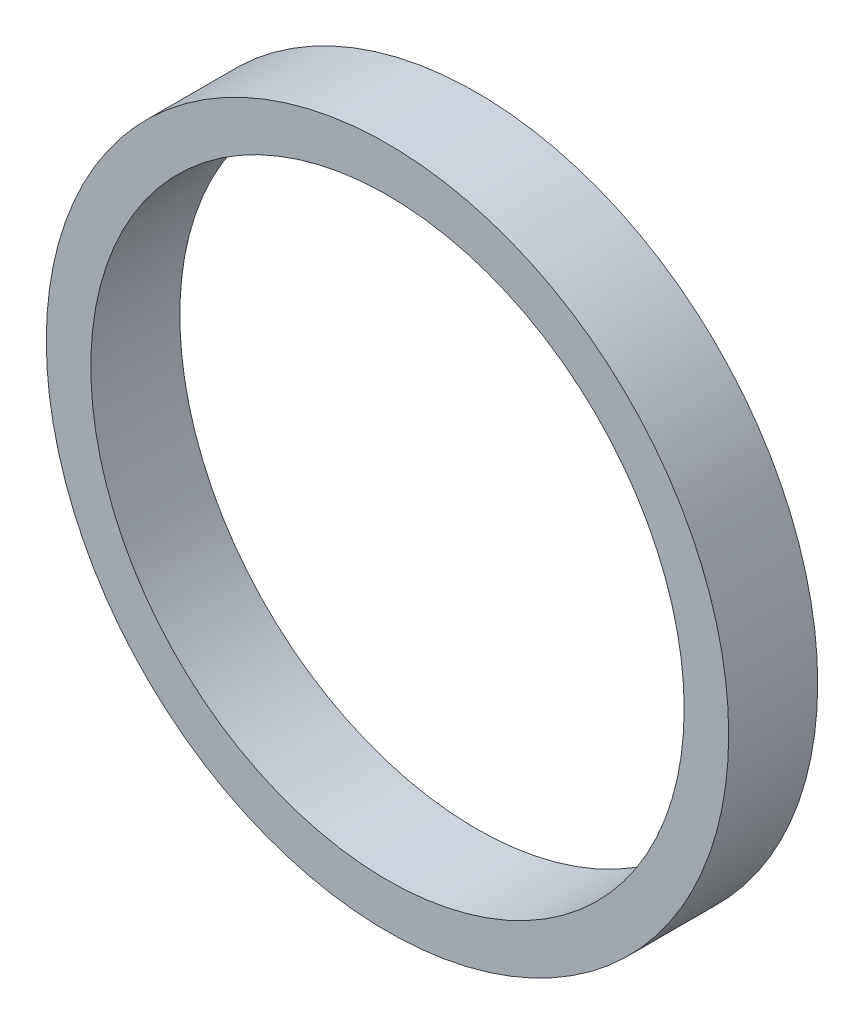
ISO-10303-21;
HEADER;
FILE_DESCRIPTION(('STEP AP214'),'2;1');
FILE_NAME('part.step','',(''),(''),'','','');
FILE_SCHEMA(('AUTOMOTIVE_DESIGN { 1 0 10303 214 1 1 1 1 }'));
ENDSEC;
DATA;
#1=APPLICATION_CONTEXT('core data for automotive mechanical design processes');
#2=APPLICATION_PROTOCOL_DEFINITION('international standard','automotive_design',2000,#1);
#3=PRODUCT_CONTEXT('',#1,'mechanical');
#4=PRODUCT('Part','Part','',(#3));
#5=PRODUCT_RELATED_PRODUCT_CATEGORY('part','',(#4));
#6=PRODUCT_DEFINITION_FORMATION('','',#4);
#7=PRODUCT_DEFINITION_CONTEXT('part definition',#1,'design');
#8=PRODUCT_DEFINITION('design','',#6,#7);
#9=PRODUCT_DEFINITION_SHAPE('','',#8);
#10=(LENGTH_UNIT() NAMED_UNIT(*) SI_UNIT(.MILLI.,.METRE.));
#11=(NAMED_UNIT(*) PLANE_ANGLE_UNIT() SI_UNIT($,.RADIAN.));
#12=(NAMED_UNIT(*) SI_UNIT($,.STERADIAN.) SOLID_ANGLE_UNIT());
#13=UNCERTAINTY_MEASURE_WITH_UNIT(LENGTH_MEASURE(1.E-05),#10,'distance_accuracy_value','');
#14=(GEOMETRIC_REPRESENTATION_CONTEXT(3) GLOBAL_UNCERTAINTY_ASSIGNED_CONTEXT((#13)) GLOBAL_UNIT_ASSIGNED_CONTEXT((#10,
#11,#12)) REPRESENTATION_CONTEXT('',''));
#15=CARTESIAN_POINT('',(0.,0.,0.));
#16=DIRECTION('',(0.,0.,1.));
#17=DIRECTION('',(1.,0.,0.));
#18=AXIS2_PLACEMENT_3D('',#15,#16,#17);
#19=CARTESIAN_POINT('',(0.,0.,1.5));
#20=DIRECTION('',(0.,0.,1.));
#21=DIRECTION('',(1.,0.,0.));
#22=AXIS2_PLACEMENT_3D('',#19,#20,#21);
#23=PLANE('',#22);
#24=CARTESIAN_POINT('',(0.,0.,1.5));
#25=DIRECTION('',(0.,0.,1.));
#26=DIRECTION('',(1.,0.,0.));
#27=AXIS2_PLACEMENT_3D('',#24,#25,#26);
#28=CIRCLE('',#27,11.5);
#29=CARTESIAN_POINT('',(11.5,0.,1.5));
#30=VERTEX_POINT('',#29);
#31=EDGE_CURVE('E10',#30,#30,#28,.T.);
#32=ORIENTED_EDGE('',*,*,#31,.T.);
#33=EDGE_LOOP('',(#32));
#34=FACE_BOUND('',#33,.T.);
#35=CARTESIAN_POINT('',(0.,0.,1.5));
#36=DIRECTION('',(0.,0.,1.));
#37=DIRECTION('',(1.,0.,0.));
#38=AXIS2_PLACEMENT_3D('',#35,#36,#37);
#39=CIRCLE('',#38,10.);
#40=CARTESIAN_POINT('',(10.,0.,1.5));
#41=VERTEX_POINT('',#40);
#42=EDGE_CURVE('E48',#41,#41,#39,.T.);
#43=ORIENTED_EDGE('',*,*,#42,.F.);
#44=EDGE_LOOP('',(#43));
#45=FACE_BOUND('',#44,.T.);
#46=ADVANCED_FACE('F33',(#34,#45),#23,.T.);
#47=CARTESIAN_POINT('',(0.,0.,-1.5));
#48=DIRECTION('',(0.,0.,1.));
#49=DIRECTION('',(1.,0.,0.));
#50=AXIS2_PLACEMENT_3D('',#47,#48,#49);
#51=PLANE('',#50);
#52=CARTESIAN_POINT('',(0.,0.,-1.5));
#53=DIRECTION('',(0.,0.,1.));
#54=DIRECTION('',(1.,0.,0.));
#55=AXIS2_PLACEMENT_3D('',#52,#53,#54);
#56=CIRCLE('',#55,11.5);
#57=CARTESIAN_POINT('',(11.5,0.,-1.5));
#58=VERTEX_POINT('',#57);
#59=EDGE_CURVE('E37',#58,#58,#56,.T.);
#60=ORIENTED_EDGE('',*,*,#59,.F.);
#61=EDGE_LOOP('',(#60));
#62=FACE_BOUND('',#61,.T.);
#63=CARTESIAN_POINT('',(0.,0.,-1.5));
#64=DIRECTION('',(0.,0.,1.));
#65=DIRECTION('',(1.,0.,0.));
#66=AXIS2_PLACEMENT_3D('',#63,#64,#65);
#67=CIRCLE('',#66,10.);
#68=CARTESIAN_POINT('',(10.,0.,-1.5));
#69=VERTEX_POINT('',#68);
#70=EDGE_CURVE('E50',#69,#69,#67,.T.);
#71=ORIENTED_EDGE('',*,*,#70,.T.);
#72=EDGE_LOOP('',(#71));
#73=FACE_BOUND('',#72,.T.);
#74=ADVANCED_FACE('F60',(#62,#73),#51,.F.);
#75=CARTESIAN_POINT('',(0.,0.,1.5));
#76=DIRECTION('',(0.,0.,-1.));
#77=DIRECTION('',(-1.,0.,0.));
#78=AXIS2_PLACEMENT_3D('',#75,#76,#77);
#79=CYLINDRICAL_SURFACE('',#78,11.5);
#80=ORIENTED_EDGE('',*,*,#31,.F.);
#81=EDGE_LOOP('',(#80));
#82=FACE_BOUND('',#81,.T.);
#83=ORIENTED_EDGE('',*,*,#59,.T.);
#84=EDGE_LOOP('',(#83));
#85=FACE_BOUND('',#84,.T.);
#86=ADVANCED_FACE('F35',(#82,#85),#79,.T.);
#87=CARTESIAN_POINT('',(0.,0.,1.5));
#88=DIRECTION('',(0.,0.,-1.));
#89=DIRECTION('',(-1.,0.,0.));
#90=AXIS2_PLACEMENT_3D('',#87,#88,#89);
#91=CYLINDRICAL_SURFACE('',#90,10.);
#92=ORIENTED_EDGE('',*,*,#42,.T.);
#93=EDGE_LOOP('',(#92));
#94=FACE_BOUND('',#93,.T.);
#95=ORIENTED_EDGE('',*,*,#70,.F.);
#96=EDGE_LOOP('',(#95));
#97=FACE_BOUND('',#96,.T.);
#98=ADVANCED_FACE('F56',(#94,#97),#91,.F.);
#99=CLOSED_SHELL('',(#46,#74,#86,#98));
#100=MANIFOLD_SOLID_BREP('B2',#99);
#101=ADVANCED_BREP_SHAPE_REPRESENTATION('',(#18,#100),#14);
#102=SHAPE_DEFINITION_REPRESENTATION(#9,#101);
ENDSEC;
END-ISO-10303-21;
